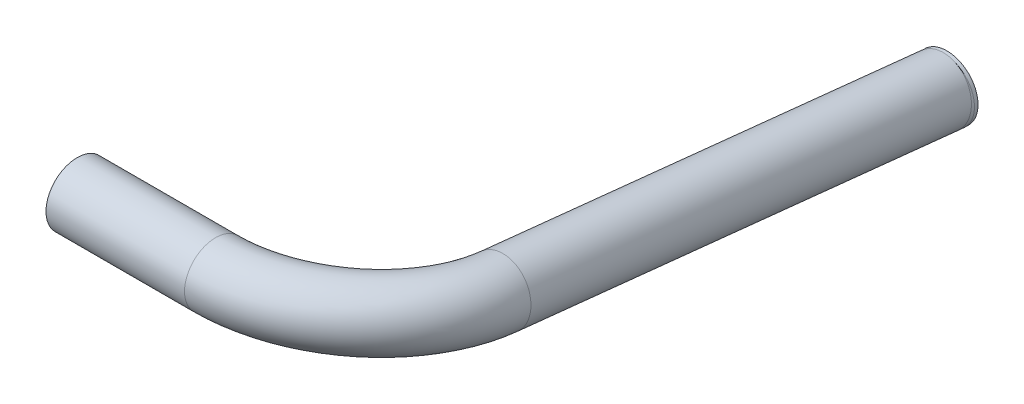
ISO-10303-21;
HEADER;
FILE_DESCRIPTION(('STEP AP214'),'2;1');
FILE_NAME('part.step','',(''),(''),'','','');
FILE_SCHEMA(('AUTOMOTIVE_DESIGN { 1 0 10303 214 1 1 1 1 }'));
ENDSEC;
DATA;
#1=APPLICATION_CONTEXT('core data for automotive mechanical design processes');
#2=APPLICATION_PROTOCOL_DEFINITION('international standard','automotive_design',2000,#1);
#3=PRODUCT_CONTEXT('',#1,'mechanical');
#4=PRODUCT('Part','Part','',(#3));
#5=PRODUCT_RELATED_PRODUCT_CATEGORY('part','',(#4));
#6=PRODUCT_DEFINITION_FORMATION('','',#4);
#7=PRODUCT_DEFINITION_CONTEXT('part definition',#1,'design');
#8=PRODUCT_DEFINITION('design','',#6,#7);
#9=PRODUCT_DEFINITION_SHAPE('','',#8);
#10=(LENGTH_UNIT() NAMED_UNIT(*) SI_UNIT(.MILLI.,.METRE.));
#11=(NAMED_UNIT(*) PLANE_ANGLE_UNIT() SI_UNIT($,.RADIAN.));
#12=(NAMED_UNIT(*) SI_UNIT($,.STERADIAN.) SOLID_ANGLE_UNIT());
#13=UNCERTAINTY_MEASURE_WITH_UNIT(LENGTH_MEASURE(1.E-05),#10,'distance_accuracy_value','');
#14=(GEOMETRIC_REPRESENTATION_CONTEXT(3) GLOBAL_UNCERTAINTY_ASSIGNED_CONTEXT((#13)) GLOBAL_UNIT_ASSIGNED_CONTEXT((#10,
#11,#12)) REPRESENTATION_CONTEXT('',''));
#15=CARTESIAN_POINT('',(0.,0.,0.));
#16=DIRECTION('',(0.,0.,1.));
#17=DIRECTION('',(1.,0.,0.));
#18=AXIS2_PLACEMENT_3D('',#15,#16,#17);
#19=CARTESIAN_POINT('',(0.,0.,0.01));
#20=DIRECTION('',(0.,0.,-1.));
#21=DIRECTION('',(-1.,0.,0.));
#22=AXIS2_PLACEMENT_3D('',#19,#20,#21);
#23=CYLINDRICAL_SURFACE('',#22,17.5);
#24=CARTESIAN_POINT('',(10.454521449378,-14.0339937745638,0.0100000000000459));
#25=CARTESIAN_POINT('',(11.0392711899848,-13.5983887141731,0.0100000000000452));
#26=CARTESIAN_POINT('',(11.6339127845426,-13.099018325782,0.0100000000000445));
#27=CARTESIAN_POINT('',(12.8159333915422,-11.9450432850229,0.0100000000000427));
#28=CARTESIAN_POINT('',(13.4034392206671,-11.2902138229971,0.0100000000000417));
#29=CARTESIAN_POINT('',(14.5282784758944,-9.80052221251378,0.0100000000000395));
#30=CARTESIAN_POINT('',(15.0656341659814,-8.96528951491148,0.0100000000000383));
#31=CARTESIAN_POINT('',(16.0284663544282,-7.1019726297933,0.0100000000000355));
#32=CARTESIAN_POINT('',(16.4537146142391,-6.07341637830697,0.010000000000034));
#33=CARTESIAN_POINT('',(17.1143122342423,-3.83554792174155,0.0100000000000307));
#34=CARTESIAN_POINT('',(17.3490496120016,-2.62585967943925,0.0100000000000289));
#35=CARTESIAN_POINT('',(17.5464760639204,-0.076414881198379,0.0100000000000251));
#36=CARTESIAN_POINT('',(17.5082277682401,1.2632700529391,0.0100000000000231));
#37=CARTESIAN_POINT('',(17.0971931980518,3.97742071696199,0.0100000000000192));
#38=CARTESIAN_POINT('',(16.723564154419,5.35109366573321,0.0100000000000172));
#39=CARTESIAN_POINT('',(15.6276343375062,8.00555097789117,0.0100000000000133));
#40=CARTESIAN_POINT('',(14.9052038953453,9.28502196816434,0.0100000000000114));
#41=CARTESIAN_POINT('',(13.1627836537823,11.6240209305916,0.010000000000008));
#42=CARTESIAN_POINT('',(12.1436186686957,12.682441684302,0.0100000000000065));
#43=CARTESIAN_POINT('',(9.91389716538034,14.4922891373544,0.0100000000000039));
#44=CARTESIAN_POINT('',(8.70463618678641,15.2434641622866,0.0100000000000028));
#45=CARTESIAN_POINT('',(6.22168558067633,16.414156065617,0.0100000000000012));
#46=CARTESIAN_POINT('',(4.94899678695674,16.8342535414699,0.0100000000000006));
#47=CARTESIAN_POINT('',(2.44970535087521,17.3747979898959,0.00999999999999991));
#48=CARTESIAN_POINT('',(1.22343963118775,17.4961226155954,0.00999999999999977));
#49=CARTESIAN_POINT('',(-1.10988142071596,17.5036931629602,0.00999999999999983));
#50=CARTESIAN_POINT('',(-2.21712189405072,17.3906330941772,0.01));
#51=CARTESIAN_POINT('',(-4.27806819004479,17.0014082202239,0.0100000000000007));
#52=CARTESIAN_POINT('',(-5.23216099962329,16.7255972205818,0.0100000000000011));
#53=CARTESIAN_POINT('',(-6.98148366942671,16.0742028382324,0.0100000000000021));
#54=CARTESIAN_POINT('',(-7.7770749485592,15.6987041828939,0.0100000000000027));
#55=CARTESIAN_POINT('',(-9.22109311713774,14.8964307638639,0.0100000000000039));
#56=CARTESIAN_POINT('',(-9.86977170877116,14.4695988349546,0.0100000000000046));
#57=CARTESIAN_POINT('',(-11.0392711899848,13.5983887141731,0.0100000000000059));
#58=CARTESIAN_POINT('',(-11.6339127845426,13.099018325782,0.0100000000000066));
#59=CARTESIAN_POINT('',(-12.8159333915422,11.9450432850229,0.0100000000000084));
#60=CARTESIAN_POINT('',(-13.4034392206671,11.2902138229971,0.0100000000000094));
#61=CARTESIAN_POINT('',(-14.5282784758944,9.80052221251379,0.0100000000000116));
#62=CARTESIAN_POINT('',(-15.0656341659814,8.96528951491149,0.0100000000000128));
#63=CARTESIAN_POINT('',(-16.0284663544282,7.10197262979331,0.0100000000000156));
#64=CARTESIAN_POINT('',(-16.4537146142391,6.07341637830697,0.0100000000000171));
#65=CARTESIAN_POINT('',(-17.1143122342423,3.83554792174155,0.0100000000000204));
#66=CARTESIAN_POINT('',(-17.3490496120016,2.62585967943926,0.0100000000000222));
#67=CARTESIAN_POINT('',(-17.5464760639204,0.0764148811983811,0.010000000000026));
#68=CARTESIAN_POINT('',(-17.5082277682401,-1.2632700529391,0.0100000000000279));
#69=CARTESIAN_POINT('',(-17.0971931980518,-3.97742071696199,0.0100000000000319));
#70=CARTESIAN_POINT('',(-16.723564154419,-5.3510936657332,0.0100000000000339));
#71=CARTESIAN_POINT('',(-15.6276343375062,-8.00555097789116,0.0100000000000378));
#72=CARTESIAN_POINT('',(-14.9052038953453,-9.28502196816433,0.0100000000000397));
#73=CARTESIAN_POINT('',(-13.1627836537823,-11.6240209305916,0.0100000000000431));
#74=CARTESIAN_POINT('',(-12.1436186686957,-12.682441684302,0.0100000000000446));
#75=CARTESIAN_POINT('',(-9.91389716538034,-14.4922891373544,0.0100000000000472));
#76=CARTESIAN_POINT('',(-8.70463618678641,-15.2434641622866,0.0100000000000482));
#77=CARTESIAN_POINT('',(-6.22168558067633,-16.414156065617,0.0100000000000499));
#78=CARTESIAN_POINT('',(-4.94899678695674,-16.8342535414699,0.0100000000000505));
#79=CARTESIAN_POINT('',(-2.44970535087522,-17.3747979898959,0.0100000000000512));
#80=CARTESIAN_POINT('',(-1.22343963118775,-17.4961226155954,0.0100000000000513));
#81=CARTESIAN_POINT('',(1.10988142071596,-17.5036931629602,0.0100000000000513));
#82=CARTESIAN_POINT('',(2.21712189405072,-17.3906330941772,0.0100000000000511));
#83=CARTESIAN_POINT('',(4.27806819004479,-17.0014082202239,0.0100000000000504));
#84=CARTESIAN_POINT('',(5.23216099962329,-16.7255972205818,0.01000000000005));
#85=CARTESIAN_POINT('',(6.98148366942671,-16.0742028382324,0.010000000000049));
#86=CARTESIAN_POINT('',(7.7770749485592,-15.6987041828939,0.0100000000000484));
#87=CARTESIAN_POINT('',(9.22109311713774,-14.8964307638639,0.0100000000000472));
#88=CARTESIAN_POINT('',(9.86977170877116,-14.4695988349546,0.0100000000000465));
#89=CARTESIAN_POINT('',(10.454521449378,-14.0339937745638,0.0100000000000459));
#90=B_SPLINE_CURVE_WITH_KNOTS('',3,(#24,#25,#26,#27,#28,#29,#30,#31,#32,#33,#34,#35,#36,#37,#38,
#39,#40,#41,#42,#43,#44,#45,#46,#47,#48,#49,#50,#51,#52,#53,#54,#55,#56,#57,#58,#59,#60,#61,#62,
#63,#64,#65,#66,#67,#68,#69,#70,#71,#72,#73,#74,#75,#76,#77,#78,#79,#80,#81,#82,#83,#84,#85,#86,
#87,#88,#89),.UNSPECIFIED.,.T.,.F.,(4,2,2,2,2,2,2,2,2,2,2,2,2,2,2,2,2,2,2,2,2,2,2,2,2,2,2,2,2,2,
2,2,4),(0.,0.03125,0.0625,0.0937500000000001,0.125,0.15625,0.1875,0.21875,0.25,0.28125,0.3125,
0.34375,0.375,0.40625,0.4375,0.46875,0.5,0.53125,0.5625,0.59375,0.625,0.65625,0.6875,0.71875,
0.75,0.78125,0.8125,0.84375,0.875,0.90625,0.9375,0.96875,1.),.UNSPECIFIED.);
#91=CARTESIAN_POINT('',(2.57312529364028,17.3098076685785,0.01));
#92=VERTEX_POINT('',#91);
#93=CARTESIAN_POINT('',(0.,17.5000000047228,0.01));
#94=VERTEX_POINT('',#93);
#95=EDGE_CURVE('E12',#92,#94,#90,.T.);
#96=ORIENTED_EDGE('',*,*,#95,.F.);
#97=CARTESIAN_POINT('',(0.,0.,0.01));
#98=DIRECTION('',(0.,0.,1.));
#99=DIRECTION('',(1.,0.,0.));
#100=AXIS2_PLACEMENT_3D('',#97,#98,#99);
#101=CIRCLE('',#100,17.5);
#102=CARTESIAN_POINT('',(10.4545545957343,-14.0340382948486,0.01));
#103=VERTEX_POINT('',#102);
#104=EDGE_CURVE('E76',#103,#92,#101,.T.);
#105=ORIENTED_EDGE('',*,*,#104,.F.);
#106=CARTESIAN_POINT('',(10.454521449378,-14.0339937745638,0.0100000000000455));
#107=CARTESIAN_POINT('',(11.0392711899848,-13.5983887141731,0.0100000000000449));
#108=CARTESIAN_POINT('',(11.6339127845426,-13.099018325782,0.0100000000000441));
#109=CARTESIAN_POINT('',(12.8159333915422,-11.9450432850229,0.0100000000000424));
#110=CARTESIAN_POINT('',(13.4034392206671,-11.2902138229971,0.0100000000000414));
#111=CARTESIAN_POINT('',(14.5282784758944,-9.80052221251378,0.0100000000000392));
#112=CARTESIAN_POINT('',(15.0656341659814,-8.96528951491148,0.010000000000038));
#113=CARTESIAN_POINT('',(16.0284663544282,-7.1019726297933,0.0100000000000352));
#114=CARTESIAN_POINT('',(16.4537146142391,-6.07341637830697,0.0100000000000337));
#115=CARTESIAN_POINT('',(17.1143122342423,-3.83554792174155,0.0100000000000304));
#116=CARTESIAN_POINT('',(17.3490496120016,-2.62585967943925,0.0100000000000286));
#117=CARTESIAN_POINT('',(17.5464760639204,-0.0764148811983791,0.0100000000000249));
#118=CARTESIAN_POINT('',(17.5082277682401,1.2632700529391,0.010000000000023));
#119=CARTESIAN_POINT('',(17.0971931980518,3.97742071696199,0.010000000000019));
#120=CARTESIAN_POINT('',(16.723564154419,5.35109366573321,0.010000000000017));
#121=CARTESIAN_POINT('',(15.6276343375062,8.00555097789117,0.0100000000000132));
#122=CARTESIAN_POINT('',(14.9052038953453,9.28502196816434,0.0100000000000113));
#123=CARTESIAN_POINT('',(13.1627836537823,11.6240209305916,0.010000000000008));
#124=CARTESIAN_POINT('',(12.1436186686957,12.682441684302,0.0100000000000065));
#125=CARTESIAN_POINT('',(9.91389716538034,14.4922891373544,0.0100000000000039));
#126=CARTESIAN_POINT('',(8.70463618678641,15.2434641622866,0.0100000000000028));
#127=CARTESIAN_POINT('',(6.22168558067633,16.414156065617,0.0100000000000012));
#128=CARTESIAN_POINT('',(4.94899678695674,16.8342535414699,0.0100000000000006));
#129=CARTESIAN_POINT('',(2.44970535087521,17.3747979898959,0.00999999999999991));
#130=CARTESIAN_POINT('',(1.22343963118775,17.4961226155954,0.00999999999999977));
#131=CARTESIAN_POINT('',(-1.10988142071596,17.5036931629602,0.00999999999999983));
#132=CARTESIAN_POINT('',(-2.21712189405072,17.3906330941772,0.01));
#133=CARTESIAN_POINT('',(-4.27806819004479,17.0014082202239,0.0100000000000007));
#134=CARTESIAN_POINT('',(-5.23216099962329,16.7255972205818,0.0100000000000011));
#135=CARTESIAN_POINT('',(-6.98148366942671,16.0742028382324,0.0100000000000021));
#136=CARTESIAN_POINT('',(-7.7770749485592,15.6987041828939,0.0100000000000027));
#137=CARTESIAN_POINT('',(-9.22109311713774,14.8964307638639,0.0100000000000039));
#138=CARTESIAN_POINT('',(-9.86977170877116,14.4695988349546,0.0100000000000045));
#139=CARTESIAN_POINT('',(-11.0392711899848,13.5983887141731,0.0100000000000058));
#140=CARTESIAN_POINT('',(-11.6339127845426,13.099018325782,0.0100000000000066));
#141=CARTESIAN_POINT('',(-12.8159333915422,11.9450432850229,0.0100000000000083));
#142=CARTESIAN_POINT('',(-13.4034392206671,11.2902138229971,0.0100000000000093));
#143=CARTESIAN_POINT('',(-14.5282784758944,9.80052221251379,0.0100000000000115));
#144=CARTESIAN_POINT('',(-15.0656341659814,8.96528951491149,0.0100000000000127));
#145=CARTESIAN_POINT('',(-16.0284663544282,7.10197262979331,0.0100000000000155));
#146=CARTESIAN_POINT('',(-16.4537146142391,6.07341637830697,0.010000000000017));
#147=CARTESIAN_POINT('',(-17.1143122342423,3.83554792174155,0.0100000000000203));
#148=CARTESIAN_POINT('',(-17.3490496120016,2.62585967943926,0.010000000000022));
#149=CARTESIAN_POINT('',(-17.5464760639204,0.0764148811983811,0.0100000000000258));
#150=CARTESIAN_POINT('',(-17.5082277682401,-1.2632700529391,0.0100000000000277));
#151=CARTESIAN_POINT('',(-17.0971931980518,-3.97742071696199,0.0100000000000317));
#152=CARTESIAN_POINT('',(-16.723564154419,-5.3510936657332,0.0100000000000337));
#153=CARTESIAN_POINT('',(-15.6276343375062,-8.00555097789116,0.0100000000000375));
#154=CARTESIAN_POINT('',(-14.9052038953453,-9.28502196816433,0.0100000000000394));
#155=CARTESIAN_POINT('',(-13.1627836537823,-11.6240209305916,0.0100000000000427));
#156=CARTESIAN_POINT('',(-12.1436186686957,-12.682441684302,0.0100000000000442));
#157=CARTESIAN_POINT('',(-9.91389716538034,-14.4922891373544,0.0100000000000468));
#158=CARTESIAN_POINT('',(-8.70463618678641,-15.2434641622866,0.0100000000000479));
#159=CARTESIAN_POINT('',(-6.22168558067633,-16.414156065617,0.0100000000000495));
#160=CARTESIAN_POINT('',(-4.94899678695674,-16.8342535414699,0.0100000000000501));
#161=CARTESIAN_POINT('',(-2.44970535087522,-17.3747979898959,0.0100000000000508));
#162=CARTESIAN_POINT('',(-1.22343963118775,-17.4961226155954,0.0100000000000509));
#163=CARTESIAN_POINT('',(1.10988142071596,-17.5036931629602,0.0100000000000509));
#164=CARTESIAN_POINT('',(2.21712189405072,-17.3906330941772,0.0100000000000507));
#165=CARTESIAN_POINT('',(4.27806819004479,-17.0014082202239,0.01000000000005));
#166=CARTESIAN_POINT('',(5.23216099962329,-16.7255972205818,0.0100000000000496));
#167=CARTESIAN_POINT('',(6.98148366942671,-16.0742028382324,0.0100000000000486));
#168=CARTESIAN_POINT('',(7.7770749485592,-15.6987041828939,0.010000000000048));
#169=CARTESIAN_POINT('',(9.22109311713774,-14.8964307638639,0.0100000000000468));
#170=CARTESIAN_POINT('',(9.86977170877116,-14.4695988349546,0.0100000000000462));
#171=CARTESIAN_POINT('',(10.454521449378,-14.0339937745638,0.0100000000000455));
#172=B_SPLINE_CURVE_WITH_KNOTS('',3,(#106,#107,#108,#109,#110,#111,#112,#113,#114,#115,#116,
#117,#118,#119,#120,#121,#122,#123,#124,#125,#126,#127,#128,#129,#130,#131,#132,#133,#134,#135,
#136,#137,#138,#139,#140,#141,#142,#143,#144,#145,#146,#147,#148,#149,#150,#151,#152,#153,#154,
#155,#156,#157,#158,#159,#160,#161,#162,#163,#164,#165,#166,#167,#168,#169,#170,#171),
.UNSPECIFIED.,.T.,.F.,(4,2,2,2,2,2,2,2,2,2,2,2,2,2,2,2,2,2,2,2,2,2,2,2,2,2,2,2,2,2,2,2,4),(0.,
0.03125,0.0625,0.0937500000000001,0.125,0.15625,0.1875,0.21875,0.25,0.28125,0.3125,0.34375,
0.375,0.40625,0.4375,0.46875,0.5,0.53125,0.5625,0.59375,0.625,0.65625,0.6875,0.71875,0.75,
0.78125,0.8125,0.84375,0.875,0.90625,0.9375,0.96875,1.),.UNSPECIFIED.);
#173=CARTESIAN_POINT('',(-1.84046396847375,17.4030473009221,0.01));
#174=VERTEX_POINT('',#173);
#175=EDGE_CURVE('E145',#174,#103,#172,.T.);
#176=ORIENTED_EDGE('',*,*,#175,.F.);
#177=CARTESIAN_POINT('',(0.,0.,0.01));
#178=DIRECTION('',(0.,0.,-1.));
#179=DIRECTION('',(-1.,0.,0.));
#180=AXIS2_PLACEMENT_3D('',#177,#178,#179);
#181=CIRCLE('',#180,17.5);
#182=EDGE_CURVE('E62',#94,#174,#181,.F.);
#183=ORIENTED_EDGE('',*,*,#182,.F.);
#184=EDGE_LOOP('',(#96,#105,#176,#183));
#185=FACE_BOUND('',#184,.T.);
#186=CARTESIAN_POINT('',(0.,0.,-2.));
#187=DIRECTION('',(0.,0.,-1.));
#188=DIRECTION('',(-1.,0.,0.));
#189=AXIS2_PLACEMENT_3D('',#186,#187,#188);
#190=CIRCLE('',#189,17.5);
#191=CARTESIAN_POINT('',(-17.5,0.,-2.));
#192=VERTEX_POINT('',#191);
#193=EDGE_CURVE('E99',#192,#192,#190,.T.);
#194=ORIENTED_EDGE('',*,*,#193,.F.);
#195=EDGE_LOOP('',(#194));
#196=FACE_BOUND('',#195,.T.);
#197=ADVANCED_FACE('F51',(#185,#196),#23,.T.);
#198=CARTESIAN_POINT('',(10.7485448706784,-13.5001059871509,3.26277222435905));
#199=CARTESIAN_POINT('',(10.454521449378,-14.0339937745638,0.01));
#200=CARTESIAN_POINT('',(10.451581215165,-14.0393326524379,-0.0225277222435904));
#201=CARTESIAN_POINT('',(10.1731241562903,-13.9455167849511,3.30950818945912));
#202=CARTESIAN_POINT('',(9.86977170877115,-14.4695988349546,0.01));
#203=CARTESIAN_POINT('',(9.86673818429596,-14.4748396554546,-0.0229950818945912));
#204=CARTESIAN_POINT('',(9.53360358470674,-14.3835469064321,3.35546971659637));
#205=CARTESIAN_POINT('',(9.22109311713774,-14.8964307638639,0.01));
#206=CARTESIAN_POINT('',(9.21796801246205,-14.9015596024383,-0.0234546971659637));
#207=CARTESIAN_POINT('',(8.10684895221839,-15.211588810921,3.44235431333431));
#208=CARTESIAN_POINT('',(7.77707494855919,-15.6987041828939,0.00999999999999999));
#209=CARTESIAN_POINT('',(7.7737772085226,-15.7035753366136,-0.0243235431333431));
#210=CARTESIAN_POINT('',(7.31936445240553,-15.6016627205077,3.48328390173883));
#211=CARTESIAN_POINT('',(6.98148366942671,-16.0742028382324,0.01));
#212=CARTESIAN_POINT('',(6.97810486159692,-16.0789282394097,-0.0247328390173883));
#213=CARTESIAN_POINT('',(5.58418729792111,-16.2860947181745,3.55509983012294));
#214=CARTESIAN_POINT('',(5.23216099962328,-16.7255972205818,0.01));
#215=CARTESIAN_POINT('',(5.22864073664031,-16.7299922456058,-0.0254509983012294));
#216=CARTESIAN_POINT('',(4.63613151575307,-16.5803761506587,3.58597812680122));
#217=CARTESIAN_POINT('',(4.27806819004478,-17.0014082202239,0.01));
#218=CARTESIAN_POINT('',(4.2744875567877,-17.0056185409195,-0.0257597812680122));
#219=CARTESIAN_POINT('',(2.58386401204517,-17.0106727946511,3.63112819733303));
#220=CARTESIAN_POINT('',(2.21712189405071,-17.3906330941772,0.01));
#221=CARTESIAN_POINT('',(2.21345447287077,-17.3944326971724,-0.0262112819733303));
#222=CARTESIAN_POINT('',(1.47925791859814,-17.1463443381805,3.64536391086933));
#223=CARTESIAN_POINT('',(1.10988142071595,-17.5036931629602,0.01));
#224=CARTESIAN_POINT('',(1.10618765573713,-17.507266651208,-0.0263536391086933));
#225=CARTESIAN_POINT('',(-0.853702699889631,-17.1878203224943,3.64971589372416));
#226=CARTESIAN_POINT('',(-1.22343963118776,-17.4961226155954,0.01));
#227=CARTESIAN_POINT('',(-1.22713700050074,-17.4992056385265,-0.0263971589372416));
#228=CARTESIAN_POINT('',(-2.08225698010501,-17.0929385851066,3.63976016389209));
#229=CARTESIAN_POINT('',(-2.44970535087522,-17.3747979898959,0.01));
#230=CARTESIAN_POINT('',(-2.45337983458292,-17.3776165839438,-0.0262976016389209));
#231=CARTESIAN_POINT('',(-4.59240573769534,-16.6079544838308,3.58887186000889));
#232=CARTESIAN_POINT('',(-4.94899678695674,-16.8342535414699,0.01));
#233=CARTESIAN_POINT('',(-4.95256269744935,-16.8365165320463,-0.0257887186000889));
#234=CARTESIAN_POINT('',(-5.87368190085092,-16.2169723774088,3.54784697652888));
#235=CARTESIAN_POINT('',(-6.22168558067634,-16.414156065617,0.01));
#236=CARTESIAN_POINT('',(-6.22516561747459,-16.4161279024991,-0.0253784697652888));
#237=CARTESIAN_POINT('',(-8.38080024200607,-15.1050779118252,3.43117836140969));
#238=CARTESIAN_POINT('',(-8.70463618678641,-15.2434641622866,0.01));
#239=CARTESIAN_POINT('',(-8.70787454623422,-15.2448480247912,-0.0242117836140969));
#240=CARTESIAN_POINT('',(-9.60565406980852,-14.3835672348283,3.35547184960981));
#241=CARTESIAN_POINT('',(-9.91389716538035,-14.4922891373544,0.01));
#242=CARTESIAN_POINT('',(-9.91697959633607,-14.4933763563797,-0.0234547184960981));
#243=CARTESIAN_POINT('',(-11.873096767851,-12.6308304537939,3.17156107458458));
#244=CARTESIAN_POINT('',(-12.1436186686957,-12.682441684302,0.01));
#245=CARTESIAN_POINT('',(-12.1463238877042,-12.6829577966071,-0.0216156107458458));
#246=CARTESIAN_POINT('',(-12.9143850727576,-11.5998273858124,3.0633802140369));
#247=CARTESIAN_POINT('',(-13.1627836537823,-11.6240209305916,0.01));
#248=CARTESIAN_POINT('',(-13.1652676395926,-11.6242628660394,-0.020533802140369));
#249=CARTESIAN_POINT('',(-14.7058092178706,-9.31071143153161,2.82318836445071));
#250=CARTESIAN_POINT('',(-14.9052038953453,-9.28502196816433,0.01));
#251=CARTESIAN_POINT('',(-14.9071978421201,-9.28476507353066,-0.0181318836445071));
#252=CARTESIAN_POINT('',(-15.4550970466475,-8.05368215041784,2.69129107569603));
#253=CARTESIAN_POINT('',(-15.6276343375062,-8.00555097789116,0.01));
#254=CARTESIAN_POINT('',(-15.6293597104148,-8.0050696661659,-0.0168129107569603));
#255=CARTESIAN_POINT('',(-16.6068364329108,-5.43732282368416,2.41676230632765));
#256=CARTESIAN_POINT('',(-16.723564154419,-5.3510936657332,0.01));
#257=CARTESIAN_POINT('',(-16.7247314316341,-5.35023137415369,-0.0140676230632765));
#258=CARTESIAN_POINT('',(-17.0093898959763,-4.07930141231371,2.27426813779733));
#259=CARTESIAN_POINT('',(-17.0971931980518,-3.97742071696199,0.01));
#260=CARTESIAN_POINT('',(-17.0980712310725,-3.97640191000847,-0.0126426813779733));
#261=CARTESIAN_POINT('',(-17.4776472975695,-1.38920398151403,1.99200219305019));
#262=CARTESIAN_POINT('',(-17.5082277682401,-1.2632700529391,0.01));
#263=CARTESIAN_POINT('',(-17.5085335729468,-1.26201071365335,-0.00982002193050187));
#264=CARTESIAN_POINT('',(-17.5441770762047,-0.0579339384133548,1.85231498613825));
#265=CARTESIAN_POINT('',(-17.5464760639204,0.076414881198383,0.01));
#266=CARTESIAN_POINT('',(-17.5464990537975,0.0777583693945004,-0.0084231498613825));
#267=CARTESIAN_POINT('',(-17.4006310548868,2.48117209319438,1.58589223333413));
#268=CARTESIAN_POINT('',(-17.3490496120016,2.62585967943926,0.01));
#269=CARTESIAN_POINT('',(-17.3485337975728,2.62730655530171,-0.00575892233334132));
#270=CARTESIAN_POINT('',(-17.1914909033208,3.68891718054627,1.45916622549814));
#271=CARTESIAN_POINT('',(-17.1143122342423,3.83554792174155,0.01));
#272=CARTESIAN_POINT('',(-17.1135404475515,3.83701422915351,-0.00449166225498138));
#273=CARTESIAN_POINT('',(-16.5782974641416,5.92794448096964,1.22423006704057));
#274=CARTESIAN_POINT('',(-16.4537146142391,6.07341637830698,0.01));
#275=CARTESIAN_POINT('',(-16.45246878574,6.07487109728035,-0.00214230067040567));
#276=CARTESIAN_POINT('',(-16.1748639632431,6.95958774213255,1.11598203244518));
#277=CARTESIAN_POINT('',(-16.0284663544282,7.10197262979331,0.01));
#278=CARTESIAN_POINT('',(-16.02700237834,7.10339647866992,-0.00105982032445176));
#279=CARTESIAN_POINT('',(-15.2515939765664,8.83253895546845,0.919457424211779));
#280=CARTESIAN_POINT('',(-15.0656341659814,8.96528951491149,0.01));
#281=CARTESIAN_POINT('',(-15.0637745678756,8.96661702050592,0.000905425757882209));
#282=CARTESIAN_POINT('',(-14.7319956469772,9.67431149613282,0.831132102335909));
#283=CARTESIAN_POINT('',(-14.5282784758944,9.80052221251379,0.01));
#284=CARTESIAN_POINT('',(-14.5262413041835,9.8017843196776,0.00178867897664091));
#285=CARTESIAN_POINT('',(-13.6388649061013,11.1791626518138,0.673231415060111));
#286=CARTESIAN_POINT('',(-13.4034392206671,11.2902138229971,0.01));
#287=CARTESIAN_POINT('',(-13.4010849638128,11.2913243347089,0.0033676858493989));
#288=CARTESIAN_POINT('',(-13.065318060649,11.8426101782261,0.603617340607335));
#289=CARTESIAN_POINT('',(-12.8159333915422,11.9450432850229,0.01));
#290=CARTESIAN_POINT('',(-12.8134395448511,11.9460676160908,0.00406382659392665));
#291=CARTESIAN_POINT('',(-11.9079294206907,13.0148530876659,0.480616497397045));
#292=CARTESIAN_POINT('',(-11.6339127845426,13.099018325782,0.01));
#293=CARTESIAN_POINT('',(-11.6311726181811,13.0998599781632,0.00529383502602954));
#294=CARTESIAN_POINT('',(-11.3239655850665,13.5238746664181,0.427205994424876));
#295=CARTESIAN_POINT('',(-11.0392711899848,13.5983887141731,0.01));
#296=CARTESIAN_POINT('',(-11.036424246034,13.5991338546506,0.00582794005575124));
#297=CARTESIAN_POINT('',(-10.1731241562903,14.4146962620185,0.333734064224719));
#298=CARTESIAN_POINT('',(-9.86977170877115,14.4695988349546,0.01));
#299=CARTESIAN_POINT('',(-9.86673818429596,14.4701478606839,0.00676265935775281));
#300=CARTESIAN_POINT('',(-9.53360358470673,14.8527263834995,0.287772537087473));
#301=CARTESIAN_POINT('',(-9.22109311713774,14.8964307638639,0.01));
#302=CARTESIAN_POINT('',(-9.21796801246205,14.8968678076676,0.00722227462912527));
#303=CARTESIAN_POINT('',(-8.10684895221837,15.6807682879884,0.200887940349536));
#304=CARTESIAN_POINT('',(-7.7770749485592,15.6987041828939,0.01));
#305=CARTESIAN_POINT('',(-7.77377720852261,15.6988835418429,0.00809112059650464));
#306=CARTESIAN_POINT('',(-7.31936445240551,16.0708421975751,0.159958351945009));
#307=CARTESIAN_POINT('',(-6.98148366942671,16.0742028382324,0.01));
#308=CARTESIAN_POINT('',(-6.97810486159692,16.074236444639,0.00850041648054991));
#309=CARTESIAN_POINT('',(-5.58418729792109,16.7552741952419,0.0881424235609013));
#310=CARTESIAN_POINT('',(-5.23216099962329,16.7255972205818,0.01));
#311=CARTESIAN_POINT('',(-5.22864073664031,16.7253004508352,0.00921857576439099));
#312=CARTESIAN_POINT('',(-4.63613151575306,17.0495556277261,0.0572641268826216));
#313=CARTESIAN_POINT('',(-4.27806819004478,17.0014082202239,0.01));
#314=CARTESIAN_POINT('',(-4.2744875567877,17.0009267461489,0.00952735873117378));
#315=CARTESIAN_POINT('',(-2.58386401204516,17.4798522717186,0.0121140563508093));
#316=CARTESIAN_POINT('',(-2.21712189405072,17.3906330941772,0.01));
#317=CARTESIAN_POINT('',(-2.21345447287077,17.3897409024017,0.00997885943649191));
#318=CARTESIAN_POINT('',(-1.47925791859813,17.6155238152479,-0.00212165718549198));
#319=CARTESIAN_POINT('',(-1.10988142071595,17.5036931629602,0.01));
#320=CARTESIAN_POINT('',(-1.10618765573713,17.5025748564373,0.0101212165718549));
#321=CARTESIAN_POINT('',(0.853702699889647,17.6569997995617,-0.00647364004032291));
#322=CARTESIAN_POINT('',(1.22343963118776,17.4961226155954,0.01));
#323=CARTESIAN_POINT('',(1.22713700050074,17.4945138437558,0.0101647364004032));
#324=CARTESIAN_POINT('',(2.08225698010502,17.562118062174,0.00348208979174871));
#325=CARTESIAN_POINT('',(2.44970535087522,17.3747979898959,0.01));
#326=CARTESIAN_POINT('',(2.45337983458292,17.3729247891732,0.0100651791020825));
#327=CARTESIAN_POINT('',(4.59240573769535,17.0771339608982,0.0543703936749569));
#328=CARTESIAN_POINT('',(4.94899678695674,16.8342535414699,0.01));
#329=CARTESIAN_POINT('',(4.95256269744935,16.8318247372756,0.00955629606325043));
#330=CARTESIAN_POINT('',(5.87368190085095,16.6861518544762,0.0953952771549621));
#331=CARTESIAN_POINT('',(6.22168558067633,16.414156065617,0.01));
#332=CARTESIAN_POINT('',(6.22516561747458,16.4114361077284,0.00914604722845038));
#333=CARTESIAN_POINT('',(8.38080024200607,15.5742573888926,0.212063892274147));
#334=CARTESIAN_POINT('',(8.70463618678641,15.2434641622866,0.01));
#335=CARTESIAN_POINT('',(8.70787454623422,15.2401562300205,0.00797936107725853));
#336=CARTESIAN_POINT('',(9.60565406980852,14.8527467118957,0.287770404074036));
#337=CARTESIAN_POINT('',(9.91389716538034,14.4922891373544,0.01));
#338=CARTESIAN_POINT('',(9.91697959633606,14.488684561609,0.00722229595925964));
#339=CARTESIAN_POINT('',(11.873096767851,13.1000099308613,0.471681179099264));
#340=CARTESIAN_POINT('',(12.1436186686957,12.682441684302,0.01));
#341=CARTESIAN_POINT('',(12.1463238877042,12.6782660018364,0.00538318820900736));
#342=CARTESIAN_POINT('',(12.9143850727576,12.0690068628798,0.579862039646946));
#343=CARTESIAN_POINT('',(13.1627836537823,11.6240209305916,0.01));
#344=CARTESIAN_POINT('',(13.1652676395926,11.6195710712687,0.00430137960353055));
#345=CARTESIAN_POINT('',(14.7058092178706,9.77989090859903,0.820053889233131));
#346=CARTESIAN_POINT('',(14.9052038953453,9.28502196816433,0.01));
#347=CARTESIAN_POINT('',(14.9071978421201,9.28007327875998,0.00189946110766869));
#348=CARTESIAN_POINT('',(15.4550970466475,8.52286162748526,0.95195117798781));
#349=CARTESIAN_POINT('',(15.6276343375062,8.00555097789116,0.01));
#350=CARTESIAN_POINT('',(15.6293597104148,8.00037787139522,0.000580488220121901));
#351=CARTESIAN_POINT('',(16.6068364329108,5.90650230075157,1.2264799473562));
#352=CARTESIAN_POINT('',(16.723564154419,5.3510936657332,0.01));
#353=CARTESIAN_POINT('',(16.7247314316341,5.34553957938302,-0.00216479947356196));
#354=CARTESIAN_POINT('',(17.0093898959763,4.54848088938114,1.36897411588651));
#355=CARTESIAN_POINT('',(17.0971931980518,3.97742071696199,0.01));
#356=CARTESIAN_POINT('',(17.0980712310725,3.97171011523779,-0.00358974115886509));
#357=CARTESIAN_POINT('',(17.4776472975695,1.85838345858145,1.65124006063366));
#358=CARTESIAN_POINT('',(17.5082277682401,1.26327005293909,0.01));
#359=CARTESIAN_POINT('',(17.5085335729468,1.25731891888267,-0.00641240060633655));
#360=CARTESIAN_POINT('',(17.5441770762047,0.527113415480772,1.79092726754559));
#361=CARTESIAN_POINT('',(17.5464760639204,-0.0764148811983875,0.01));
#362=CARTESIAN_POINT('',(17.5464990537975,-0.0824501641651791,-0.00780927267545595));
#363=CARTESIAN_POINT('',(17.4006310548868,-2.01199261612696,2.05735002034971));
#364=CARTESIAN_POINT('',(17.3490496120016,-2.62585967943926,0.01));
#365=CARTESIAN_POINT('',(17.3485337975728,-2.63199835007239,-0.0104735002034971));
#366=CARTESIAN_POINT('',(17.1914909033208,-3.21973770347884,2.18407602818571));
#367=CARTESIAN_POINT('',(17.1143122342423,-3.83554792174156,0.01));
#368=CARTESIAN_POINT('',(17.1135404475515,-3.84170602392418,-0.0117407602818571));
#369=CARTESIAN_POINT('',(16.5782974641416,-5.45876500390222,2.41901218664328));
#370=CARTESIAN_POINT('',(16.4537146142391,-6.07341637830698,0.01));
#371=CARTESIAN_POINT('',(16.45246878574,-6.07956289205102,-0.0140901218664328));
#372=CARTESIAN_POINT('',(16.1748639632431,-6.49040826506513,2.52726022123867));
#373=CARTESIAN_POINT('',(16.0284663544282,-7.10197262979331,0.01));
#374=CARTESIAN_POINT('',(16.02700237834,-7.10808827344059,-0.0151726022123867));
#375=CARTESIAN_POINT('',(15.2515939765664,-8.36335947840102,2.72378482947206));
#376=CARTESIAN_POINT('',(15.0656341659814,-8.96528951491149,0.01));
#377=CARTESIAN_POINT('',(15.0637745678756,-8.9713088152766,-0.0171378482947206));
#378=CARTESIAN_POINT('',(14.7319956469772,-9.2051320190654,2.81211015134794));
#379=CARTESIAN_POINT('',(14.5282784758944,-9.80052221251379,0.01));
#380=CARTESIAN_POINT('',(14.5262413041835,-9.80647611444827,-0.0180211015134794));
#381=CARTESIAN_POINT('',(13.6388649061013,-10.7099831747464,2.97001083862373));
#382=CARTESIAN_POINT('',(13.4034392206671,-11.2902138229971,0.01));
#383=CARTESIAN_POINT('',(13.4010849638128,-11.2960161294796,-0.0196001083862373));
#384=CARTESIAN_POINT('',(13.065318060649,-11.3734307011586,3.03962491307651));
#385=CARTESIAN_POINT('',(12.8159333915422,-11.9450432850229,0.01));
#386=CARTESIAN_POINT('',(12.8134395448512,-11.9507594108615,-0.0202962491307651));
#387=CARTESIAN_POINT('',(11.9079294206907,-12.5456736105985,3.1626257562868));
#388=CARTESIAN_POINT('',(11.6339127845426,-13.099018325782,0.01));
#389=CARTESIAN_POINT('',(11.6311726181811,-13.1045517729339,-0.021526257562868));
#390=CARTESIAN_POINT('',(11.3239655850665,-13.0546951893506,3.21603625925897));
#391=CARTESIAN_POINT('',(11.0392711899848,-13.5983887141731,0.01));
#392=CARTESIAN_POINT('',(11.036424246034,-13.6038256494213,-0.0220603625925897));
#393=CARTESIAN_POINT('',(10.7485448706784,-13.5001059871509,3.26277222435905));
#394=CARTESIAN_POINT('',(10.454521449378,-14.0339937745638,0.01));
#395=CARTESIAN_POINT('',(10.451581215165,-14.0393326524379,-0.0225277222435904));
#396=B_SPLINE_SURFACE_WITH_KNOTS('',3,1,((#198,#199,#200),(#201,#202,#203),(#204,#205,#206),
(#207,#208,#209),(#210,#211,#212),(#213,#214,#215),(#216,#217,#218),(#219,#220,#221),(#222,#223,
#224),(#225,#226,#227),(#228,#229,#230),(#231,#232,#233),(#234,#235,#236),(#237,#238,#239),
(#240,#241,#242),(#243,#244,#245),(#246,#247,#248),(#249,#250,#251),(#252,#253,#254),(#255,#256,
#257),(#258,#259,#260),(#261,#262,#263),(#264,#265,#266),(#267,#268,#269),(#270,#271,#272),
(#273,#274,#275),(#276,#277,#278),(#279,#280,#281),(#282,#283,#284),(#285,#286,#287),(#288,#289,
#290),(#291,#292,#293),(#294,#295,#296),(#297,#298,#299),(#300,#301,#302),(#303,#304,#305),
(#306,#307,#308),(#309,#310,#311),(#312,#313,#314),(#315,#316,#317),(#318,#319,#320),(#321,#322,
#323),(#324,#325,#326),(#327,#328,#329),(#330,#331,#332),(#333,#334,#335),(#336,#337,#338),
(#339,#340,#341),(#342,#343,#344),(#345,#346,#347),(#348,#349,#350),(#351,#352,#353),(#354,#355,
#356),(#357,#358,#359),(#360,#361,#362),(#363,#364,#365),(#366,#367,#368),(#369,#370,#371),
(#372,#373,#374),(#375,#376,#377),(#378,#379,#380),(#381,#382,#383),(#384,#385,#386),(#387,#388,
#389),(#390,#391,#392),(#393,#394,#395)),.UNSPECIFIED.,.T.,.F.,.F.,(4,2,2,2,2,2,2,2,2,2,2,2,2,2,
2,2,2,2,2,2,2,2,2,2,2,2,2,2,2,2,2,2,4),(2,1,2),(0.,0.0312500000000001,0.0625000000000001,
0.0937500000000001,0.125,0.15625,0.1875,0.21875,0.25,0.28125,0.3125,0.34375,0.375,0.40625,
0.4375,0.46875,0.5,0.53125,0.5625,0.59375,0.625,0.65625,0.6875,0.71875,0.75,0.78125,0.8125,
0.84375,0.875,0.90625,0.9375,0.96875,1.),(0.,1.,1.01),.UNSPECIFIED.);
#397=CARTESIAN_POINT('',(0.,0.234589738533712,1.82162112684192));
#398=DIRECTION('',(0.,-0.104354884860902,-0.994540123879207));
#399=DIRECTION('',(-0.994540123879207,0.103785120116962,-0.010889941994332));
#400=AXIS2_PLACEMENT_3D('',#397,#398,#399);
#401=CIRCLE('',#400,17.5);
#402=CARTESIAN_POINT('',(10.7485448706784,-13.5001059871509,3.26277222435904));
#403=VERTEX_POINT('',#402);
#404=CARTESIAN_POINT('',(-0.370129464077041,17.6351899478348,-0.00418518077040642));
#405=VERTEX_POINT('',#404);
#406=EDGE_CURVE('E87',#403,#405,#401,.T.);
#407=CARTESIAN_POINT('',(10.7485448706784,-13.5001059871509,3.26277222435905));
#408=CARTESIAN_POINT('',(10.1731241562903,-13.9455167849511,3.30950818945912));
#409=CARTESIAN_POINT('',(9.53360358470674,-14.3835469064321,3.35546971659637));
#410=CARTESIAN_POINT('',(8.10684895221839,-15.211588810921,3.44235431333431));
#411=CARTESIAN_POINT('',(7.31936445240553,-15.6016627205077,3.48328390173883));
#412=CARTESIAN_POINT('',(5.58418729792111,-16.2860947181745,3.55509983012294));
#413=CARTESIAN_POINT('',(4.63613151575307,-16.5803761506587,3.58597812680122));
#414=CARTESIAN_POINT('',(2.58386401204517,-17.0106727946511,3.63112819733303));
#415=CARTESIAN_POINT('',(1.47925791859814,-17.1463443381805,3.64536391086933));
#416=CARTESIAN_POINT('',(-0.853702699889631,-17.1878203224943,3.64971589372416));
#417=CARTESIAN_POINT('',(-2.08225698010501,-17.0929385851066,3.63976016389209));
#418=CARTESIAN_POINT('',(-4.59240573769534,-16.6079544838308,3.58887186000889));
#419=CARTESIAN_POINT('',(-5.87368190085092,-16.2169723774088,3.54784697652888));
#420=CARTESIAN_POINT('',(-8.38080024200607,-15.1050779118252,3.43117836140969));
#421=CARTESIAN_POINT('',(-9.60565406980852,-14.3835672348283,3.35547184960981));
#422=CARTESIAN_POINT('',(-11.873096767851,-12.6308304537939,3.17156107458458));
#423=CARTESIAN_POINT('',(-12.9143850727576,-11.5998273858124,3.0633802140369));
#424=CARTESIAN_POINT('',(-14.7058092178706,-9.31071143153161,2.82318836445071));
#425=CARTESIAN_POINT('',(-15.4550970466475,-8.05368215041784,2.69129107569603));
#426=CARTESIAN_POINT('',(-16.6068364329108,-5.43732282368416,2.41676230632765));
#427=CARTESIAN_POINT('',(-17.0093898959763,-4.07930141231371,2.27426813779733));
#428=CARTESIAN_POINT('',(-17.4776472975695,-1.38920398151403,1.99200219305019));
#429=CARTESIAN_POINT('',(-17.5441770762047,-0.0579339384133548,1.85231498613825));
#430=CARTESIAN_POINT('',(-17.4006310548868,2.48117209319438,1.58589223333413));
#431=CARTESIAN_POINT('',(-17.1914909033208,3.68891718054627,1.45916622549814));
#432=CARTESIAN_POINT('',(-16.5782974641416,5.92794448096964,1.22423006704057));
#433=CARTESIAN_POINT('',(-16.1748639632431,6.95958774213255,1.11598203244518));
#434=CARTESIAN_POINT('',(-15.2515939765664,8.83253895546845,0.919457424211779));
#435=CARTESIAN_POINT('',(-14.7319956469772,9.67431149613282,0.831132102335909));
#436=CARTESIAN_POINT('',(-13.6388649061013,11.1791626518138,0.673231415060111));
#437=CARTESIAN_POINT('',(-13.065318060649,11.8426101782261,0.603617340607335));
#438=CARTESIAN_POINT('',(-11.9079294206907,13.0148530876659,0.480616497397045));
#439=CARTESIAN_POINT('',(-11.3239655850665,13.5238746664181,0.427205994424876));
#440=CARTESIAN_POINT('',(-10.1731241562903,14.4146962620185,0.333734064224719));
#441=CARTESIAN_POINT('',(-9.53360358470673,14.8527263834995,0.287772537087473));
#442=CARTESIAN_POINT('',(-8.10684895221837,15.6807682879884,0.200887940349536));
#443=CARTESIAN_POINT('',(-7.31936445240551,16.0708421975751,0.159958351945009));
#444=CARTESIAN_POINT('',(-5.58418729792109,16.7552741952419,0.0881424235609013));
#445=CARTESIAN_POINT('',(-4.63613151575306,17.0495556277261,0.0572641268826216));
#446=CARTESIAN_POINT('',(-2.58386401204516,17.4798522717186,0.0121140563508093));
#447=CARTESIAN_POINT('',(-1.47925791859813,17.6155238152479,-0.00212165718549198));
#448=CARTESIAN_POINT('',(0.853702699889647,17.6569997995617,-0.00647364004032291));
#449=CARTESIAN_POINT('',(2.08225698010502,17.562118062174,0.00348208979174871));
#450=CARTESIAN_POINT('',(4.59240573769535,17.0771339608982,0.0543703936749569));
#451=CARTESIAN_POINT('',(5.87368190085095,16.6861518544762,0.0953952771549621));
#452=CARTESIAN_POINT('',(8.38080024200607,15.5742573888926,0.212063892274147));
#453=CARTESIAN_POINT('',(9.60565406980852,14.8527467118957,0.287770404074036));
#454=CARTESIAN_POINT('',(11.873096767851,13.1000099308613,0.471681179099264));
#455=CARTESIAN_POINT('',(12.9143850727576,12.0690068628798,0.579862039646946));
#456=CARTESIAN_POINT('',(14.7058092178706,9.77989090859903,0.820053889233131));
#457=CARTESIAN_POINT('',(15.4550970466475,8.52286162748526,0.95195117798781));
#458=CARTESIAN_POINT('',(16.6068364329108,5.90650230075157,1.2264799473562));
#459=CARTESIAN_POINT('',(17.0093898959763,4.54848088938114,1.36897411588651));
#460=CARTESIAN_POINT('',(17.4776472975695,1.85838345858145,1.65124006063366));
#461=CARTESIAN_POINT('',(17.5441770762047,0.527113415480772,1.79092726754559));
#462=CARTESIAN_POINT('',(17.4006310548868,-2.01199261612696,2.05735002034971));
#463=CARTESIAN_POINT('',(17.1914909033208,-3.21973770347884,2.18407602818571));
#464=CARTESIAN_POINT('',(16.5782974641416,-5.45876500390222,2.41901218664328));
#465=CARTESIAN_POINT('',(16.1748639632431,-6.49040826506513,2.52726022123867));
#466=CARTESIAN_POINT('',(15.2515939765664,-8.36335947840102,2.72378482947206));
#467=CARTESIAN_POINT('',(14.7319956469772,-9.2051320190654,2.81211015134794));
#468=CARTESIAN_POINT('',(13.6388649061013,-10.7099831747464,2.97001083862373));
#469=CARTESIAN_POINT('',(13.065318060649,-11.3734307011586,3.03962491307651));
#470=CARTESIAN_POINT('',(11.9079294206907,-12.5456736105985,3.1626257562868));
#471=CARTESIAN_POINT('',(11.3239655850665,-13.0546951893506,3.21603625925897));
#472=CARTESIAN_POINT('',(10.7485448706784,-13.5001059871509,3.26277222435905));
#473=B_SPLINE_CURVE_WITH_KNOTS('',3,(#407,#408,#409,#410,#411,#412,#413,#414,#415,#416,#417,
#418,#419,#420,#421,#422,#423,#424,#425,#426,#427,#428,#429,#430,#431,#432,#433,#434,#435,#436,
#437,#438,#439,#440,#441,#442,#443,#444,#445,#446,#447,#448,#449,#450,#451,#452,#453,#454,#455,
#456,#457,#458,#459,#460,#461,#462,#463,#464,#465,#466,#467,#468,#469,#470,#471,#472),
.UNSPECIFIED.,.T.,.F.,(4,2,2,2,2,2,2,2,2,2,2,2,2,2,2,2,2,2,2,2,2,2,2,2,2,2,2,2,2,2,2,2,4),(0.,
0.0312500000000001,0.0625000000000001,0.0937500000000001,0.125,0.15625,0.1875,0.21875,0.25,
0.28125,0.3125,0.34375,0.375,0.40625,0.4375,0.46875,0.5,0.53125,0.5625,0.59375,0.625,0.65625,
0.6875,0.71875,0.75,0.78125,0.8125,0.84375,0.875,0.90625,0.9375,0.96875,1.),.UNSPECIFIED.);
#474=EDGE_CURVE('E68',#405,#403,#473,.T.);
#475=ORIENTED_EDGE('',*,*,#406,.T.);
#476=ORIENTED_EDGE('',*,*,#474,.T.);
#477=EDGE_LOOP('',(#475,#476));
#478=FACE_BOUND('',#477,.T.);
#479=ORIENTED_EDGE('',*,*,#104,.T.);
#480=ORIENTED_EDGE('',*,*,#95,.T.);
#481=ORIENTED_EDGE('',*,*,#182,.T.);
#482=ORIENTED_EDGE('',*,*,#175,.T.);
#483=EDGE_LOOP('',(#479,#480,#481,#482));
#484=FACE_BOUND('',#483,.T.);
#485=ADVANCED_FACE('F96',(#478,#484),#396,.T.);
#486=CARTESIAN_POINT('',(-147.83,34.5499999999999,328.86));
#487=DIRECTION('',(-1.,0.,0.));
#488=DIRECTION('',(0.,0.,1.));
#489=AXIS2_PLACEMENT_3D('',#486,#487,#488);
#490=CYLINDRICAL_SURFACE('',#489,17.5);
#491=CARTESIAN_POINT('',(-157.83,34.5499999999999,328.86));
#492=DIRECTION('',(1.,0.,0.));
#493=DIRECTION('',(0.,0.,-1.));
#494=AXIS2_PLACEMENT_3D('',#491,#492,#493);
#495=CIRCLE('',#494,17.5);
#496=CARTESIAN_POINT('',(-157.83,34.5499999999999,311.36));
#497=VERTEX_POINT('',#496);
#498=EDGE_CURVE('E92',#497,#497,#495,.T.);
#499=ORIENTED_EDGE('',*,*,#498,.T.);
#500=EDGE_LOOP('',(#499));
#501=FACE_BOUND('',#500,.T.);
#502=CARTESIAN_POINT('',(-80.,34.5499999999999,328.86));
#503=DIRECTION('',(1.,0.,0.));
#504=DIRECTION('',(0.,0.,-1.));
#505=AXIS2_PLACEMENT_3D('',#502,#503,#504);
#506=CIRCLE('',#505,17.5);
#507=CARTESIAN_POINT('',(-80.,36.3762104850657,346.264452167886));
#508=VERTEX_POINT('',#507);
#509=EDGE_CURVE('E181',#508,#508,#506,.T.);
#510=ORIENTED_EDGE('',*,*,#509,.F.);
#511=EDGE_LOOP('',(#510));
#512=FACE_BOUND('',#511,.T.);
#513=ADVANCED_FACE('F120',(#501,#512),#490,.T.);
#514=CARTESIAN_POINT('',(-157.83,34.5499999999999,328.86));
#515=DIRECTION('',(1.,0.,0.));
#516=DIRECTION('',(0.,0.,-1.));
#517=AXIS2_PLACEMENT_3D('',#514,#515,#516);
#518=PLANE('',#517);
#519=ORIENTED_EDGE('',*,*,#498,.F.);
#520=EDGE_LOOP('',(#519));
#521=FACE_BOUND('',#520,.T.);
#522=ADVANCED_FACE('F188',(#521),#518,.F.);
#523=CARTESIAN_POINT('',(0.,0.234589738533712,1.82162112684192));
#524=DIRECTION('',(0.,0.104354884860902,0.994540123879207));
#525=DIRECTION('',(0.,-0.994540123879207,0.104354884860902));
#526=AXIS2_PLACEMENT_3D('',#523,#524,#525);
#527=CYLINDRICAL_SURFACE('',#526,17.5);
#528=CARTESIAN_POINT('',(0.,26.2016092111278,249.296790089664));
#529=DIRECTION('',(0.,-0.104354884860902,-0.994540123879207));
#530=DIRECTION('',(-0.994540123879207,0.103785120116962,-0.010889941994332));
#531=AXIS2_PLACEMENT_3D('',#528,#529,#530);
#532=CIRCLE('',#531,17.5);
#533=CARTESIAN_POINT('',(17.5,26.2016092111278,249.296790089664));
#534=VERTEX_POINT('',#533);
#535=EDGE_CURVE('E98',#534,#534,#532,.T.);
#536=ORIENTED_EDGE('',*,*,#535,.T.);
#537=EDGE_LOOP('',(#536));
#538=FACE_BOUND('',#537,.T.);
#539=ORIENTED_EDGE('',*,*,#474,.F.);
#540=ORIENTED_EDGE('',*,*,#406,.F.);
#541=EDGE_LOOP('',(#539,#540));
#542=FACE_BOUND('',#541,.T.);
#543=ADVANCED_FACE('F89',(#538,#542),#527,.T.);
#544=CARTESIAN_POINT('',(-80.,26.2016092111278,249.296790089663));
#545=DIRECTION('',(0.,-0.994540123879207,0.104354884860902));
#546=DIRECTION('',(0.,-0.104354884860902,-0.994540123879207));
#547=AXIS2_PLACEMENT_3D('',#544,#545,#546);
#548=TOROIDAL_SURFACE('',#547,80.,17.5);
#549=CARTESIAN_POINT('',(-80.,26.2016092111278,249.296790089663));
#550=DIRECTION('',(0.,-0.994540123879207,0.104354884860902));
#551=DIRECTION('',(0.,-0.104354884860902,-0.994540123879207));
#552=AXIS2_PLACEMENT_3D('',#549,#550,#551);
#553=CIRCLE('',#552,97.5);
#554=EDGE_CURVE('',#534,#508,#553,.T.);
#555=ORIENTED_EDGE('',*,*,#535,.F.);
#556=ORIENTED_EDGE('',*,*,#509,.T.);
#557=ORIENTED_EDGE('',*,*,#554,.T.);
#558=ORIENTED_EDGE('',*,*,#554,.F.);
#559=EDGE_LOOP('',(#555,#557,#556,#558));
#560=FACE_BOUND('',#559,.T.);
#561=ADVANCED_FACE('F190',(#560),#548,.T.);
#562=CARTESIAN_POINT('',(0.,0.,-2.));
#563=DIRECTION('',(0.,0.,-1.));
#564=DIRECTION('',(-1.,0.,0.));
#565=AXIS2_PLACEMENT_3D('',#562,#563,#564);
#566=PLANE('',#565);
#567=ORIENTED_EDGE('',*,*,#193,.T.);
#568=EDGE_LOOP('',(#567));
#569=FACE_BOUND('',#568,.T.);
#570=ADVANCED_FACE('F196',(#569),#566,.T.);
#571=CLOSED_SHELL('',(#197,#485,#513,#522,#543,#561,#570));
#572=MANIFOLD_SOLID_BREP('B2',#571);
#573=ADVANCED_BREP_SHAPE_REPRESENTATION('',(#18,#572),#14);
#574=SHAPE_DEFINITION_REPRESENTATION(#9,#573);
ENDSEC;
END-ISO-10303-21;
